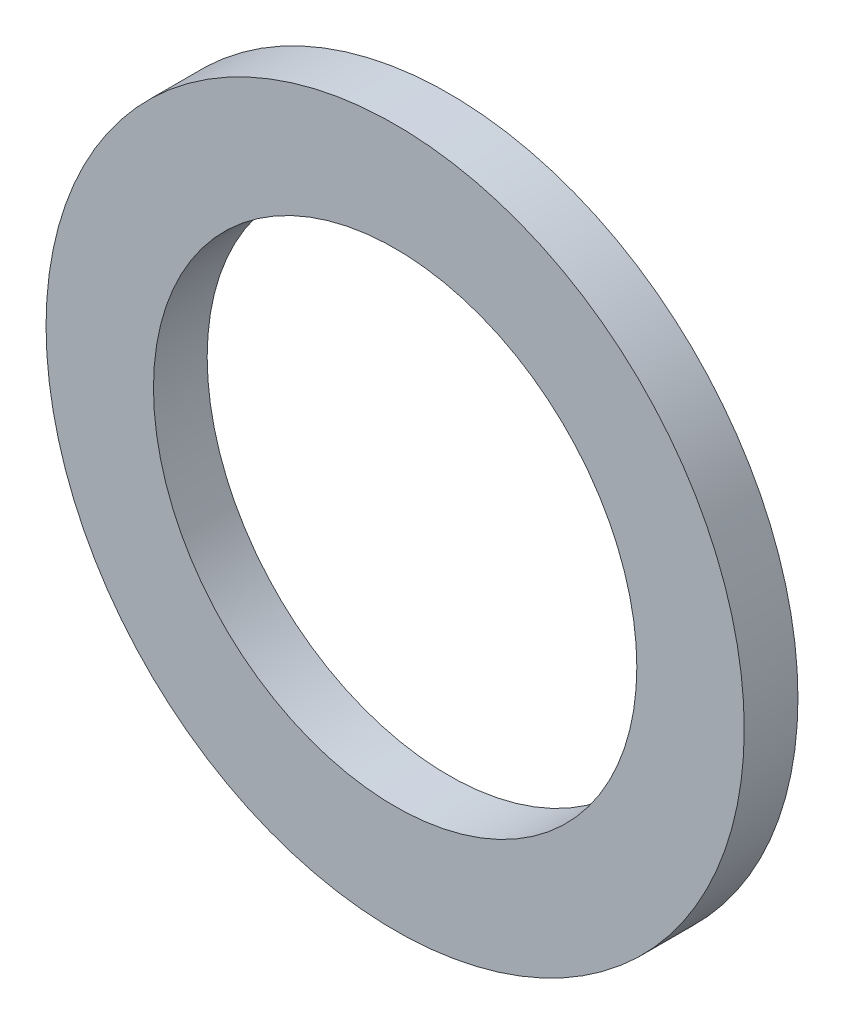
ISO-10303-21;
HEADER;
FILE_DESCRIPTION(('STEP AP214'),'2;1');
FILE_NAME('part.step','',(''),(''),'','','');
FILE_SCHEMA(('AUTOMOTIVE_DESIGN { 1 0 10303 214 1 1 1 1 }'));
ENDSEC;
DATA;
#1=APPLICATION_CONTEXT('core data for automotive mechanical design processes');
#2=APPLICATION_PROTOCOL_DEFINITION('international standard','automotive_design',2000,#1);
#3=PRODUCT_CONTEXT('',#1,'mechanical');
#4=PRODUCT('Part','Part','',(#3));
#5=PRODUCT_RELATED_PRODUCT_CATEGORY('part','',(#4));
#6=PRODUCT_DEFINITION_FORMATION('','',#4);
#7=PRODUCT_DEFINITION_CONTEXT('part definition',#1,'design');
#8=PRODUCT_DEFINITION('design','',#6,#7);
#9=PRODUCT_DEFINITION_SHAPE('','',#8);
#10=(LENGTH_UNIT() NAMED_UNIT(*) SI_UNIT(.MILLI.,.METRE.));
#11=(NAMED_UNIT(*) PLANE_ANGLE_UNIT() SI_UNIT($,.RADIAN.));
#12=(NAMED_UNIT(*) SI_UNIT($,.STERADIAN.) SOLID_ANGLE_UNIT());
#13=UNCERTAINTY_MEASURE_WITH_UNIT(LENGTH_MEASURE(1.E-05),#10,'distance_accuracy_value','');
#14=(GEOMETRIC_REPRESENTATION_CONTEXT(3) GLOBAL_UNCERTAINTY_ASSIGNED_CONTEXT((#13)) GLOBAL_UNIT_ASSIGNED_CONTEXT((#10,
#11,#12)) REPRESENTATION_CONTEXT('',''));
#15=CARTESIAN_POINT('',(0.,0.,0.));
#16=DIRECTION('',(0.,0.,1.));
#17=DIRECTION('',(1.,0.,0.));
#18=AXIS2_PLACEMENT_3D('',#15,#16,#17);
#19=CARTESIAN_POINT('',(0.,0.,2.));
#20=DIRECTION('',(0.,0.,1.));
#21=DIRECTION('',(1.,0.,0.));
#22=AXIS2_PLACEMENT_3D('',#19,#20,#21);
#23=PLANE('',#22);
#24=CARTESIAN_POINT('',(0.,0.,2.));
#25=DIRECTION('',(0.,0.,1.));
#26=DIRECTION('',(1.,0.,0.));
#27=AXIS2_PLACEMENT_3D('',#24,#25,#26);
#28=CIRCLE('',#27,13.);
#29=CARTESIAN_POINT('',(13.,0.,2.));
#30=VERTEX_POINT('',#29);
#31=EDGE_CURVE('E10',#30,#30,#28,.T.);
#32=ORIENTED_EDGE('',*,*,#31,.T.);
#33=EDGE_LOOP('',(#32));
#34=FACE_BOUND('',#33,.T.);
#35=CARTESIAN_POINT('',(0.,0.,2.));
#36=DIRECTION('',(0.,0.,1.));
#37=DIRECTION('',(1.,0.,0.));
#38=AXIS2_PLACEMENT_3D('',#35,#36,#37);
#39=CIRCLE('',#38,9.);
#40=CARTESIAN_POINT('',(9.,0.,2.));
#41=VERTEX_POINT('',#40);
#42=EDGE_CURVE('E45',#41,#41,#39,.T.);
#43=ORIENTED_EDGE('',*,*,#42,.F.);
#44=EDGE_LOOP('',(#43));
#45=FACE_BOUND('',#44,.T.);
#46=ADVANCED_FACE('F34',(#34,#45),#23,.T.);
#47=CARTESIAN_POINT('',(0.,0.,0.));
#48=DIRECTION('',(0.,0.,1.));
#49=DIRECTION('',(1.,0.,0.));
#50=AXIS2_PLACEMENT_3D('',#47,#48,#49);
#51=PLANE('',#50);
#52=CARTESIAN_POINT('',(0.,0.,0.));
#53=DIRECTION('',(0.,0.,1.));
#54=DIRECTION('',(1.,0.,0.));
#55=AXIS2_PLACEMENT_3D('',#52,#53,#54);
#56=CIRCLE('',#55,13.);
#57=CARTESIAN_POINT('',(13.,0.,0.));
#58=VERTEX_POINT('',#57);
#59=EDGE_CURVE('E38',#58,#58,#56,.T.);
#60=ORIENTED_EDGE('',*,*,#59,.F.);
#61=EDGE_LOOP('',(#60));
#62=FACE_BOUND('',#61,.T.);
#63=CARTESIAN_POINT('',(0.,0.,0.));
#64=DIRECTION('',(0.,0.,1.));
#65=DIRECTION('',(1.,0.,0.));
#66=AXIS2_PLACEMENT_3D('',#63,#64,#65);
#67=CIRCLE('',#66,9.);
#68=CARTESIAN_POINT('',(9.,0.,0.));
#69=VERTEX_POINT('',#68);
#70=EDGE_CURVE('E47',#69,#69,#67,.T.);
#71=ORIENTED_EDGE('',*,*,#70,.T.);
#72=EDGE_LOOP('',(#71));
#73=FACE_BOUND('',#72,.T.);
#74=ADVANCED_FACE('F57',(#62,#73),#51,.F.);
#75=CARTESIAN_POINT('',(0.,0.,2.));
#76=DIRECTION('',(0.,0.,-1.));
#77=DIRECTION('',(-1.,0.,0.));
#78=AXIS2_PLACEMENT_3D('',#75,#76,#77);
#79=CYLINDRICAL_SURFACE('',#78,13.);
#80=ORIENTED_EDGE('',*,*,#31,.F.);
#81=EDGE_LOOP('',(#80));
#82=FACE_BOUND('',#81,.T.);
#83=ORIENTED_EDGE('',*,*,#59,.T.);
#84=EDGE_LOOP('',(#83));
#85=FACE_BOUND('',#84,.T.);
#86=ADVANCED_FACE('F36',(#82,#85),#79,.T.);
#87=CARTESIAN_POINT('',(0.,0.,2.));
#88=DIRECTION('',(0.,0.,-1.));
#89=DIRECTION('',(-1.,0.,0.));
#90=AXIS2_PLACEMENT_3D('',#87,#88,#89);
#91=CYLINDRICAL_SURFACE('',#90,9.);
#92=ORIENTED_EDGE('',*,*,#42,.T.);
#93=EDGE_LOOP('',(#92));
#94=FACE_BOUND('',#93,.T.);
#95=ORIENTED_EDGE('',*,*,#70,.F.);
#96=EDGE_LOOP('',(#95));
#97=FACE_BOUND('',#96,.T.);
#98=ADVANCED_FACE('F53',(#94,#97),#91,.F.);
#99=CLOSED_SHELL('',(#46,#74,#86,#98));
#100=MANIFOLD_SOLID_BREP('B2',#99);
#101=ADVANCED_BREP_SHAPE_REPRESENTATION('',(#18,#100),#14);
#102=SHAPE_DEFINITION_REPRESENTATION(#9,#101);
ENDSEC;
END-ISO-10303-21;
